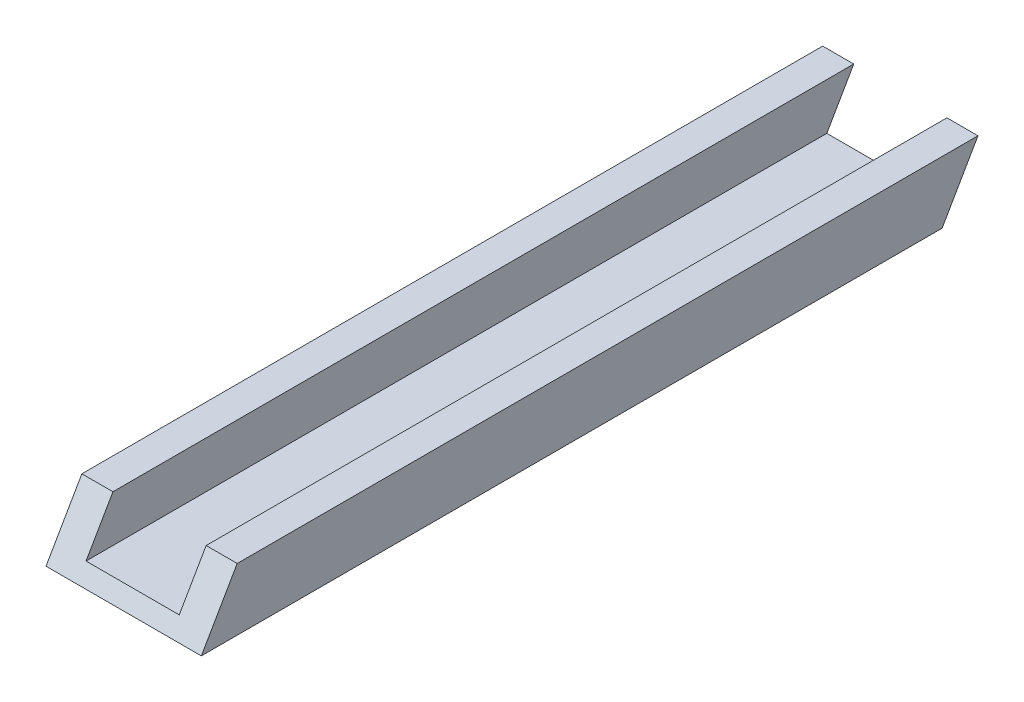
ISO-10303-21;
HEADER;
FILE_DESCRIPTION(('STEP AP214'),'2;1');
FILE_NAME('part.step','',(''),(''),'','','');
FILE_SCHEMA(('AUTOMOTIVE_DESIGN { 1 0 10303 214 1 1 1 1 }'));
ENDSEC;
DATA;
#1=APPLICATION_CONTEXT('core data for automotive mechanical design processes');
#2=APPLICATION_PROTOCOL_DEFINITION('international standard','automotive_design',2000,#1);
#3=PRODUCT_CONTEXT('',#1,'mechanical');
#4=PRODUCT('Part','Part','',(#3));
#5=PRODUCT_RELATED_PRODUCT_CATEGORY('part','',(#4));
#6=PRODUCT_DEFINITION_FORMATION('','',#4);
#7=PRODUCT_DEFINITION_CONTEXT('part definition',#1,'design');
#8=PRODUCT_DEFINITION('design','',#6,#7);
#9=PRODUCT_DEFINITION_SHAPE('','',#8);
#10=(LENGTH_UNIT() NAMED_UNIT(*) SI_UNIT(.MILLI.,.METRE.));
#11=(NAMED_UNIT(*) PLANE_ANGLE_UNIT() SI_UNIT($,.RADIAN.));
#12=(NAMED_UNIT(*) SI_UNIT($,.STERADIAN.) SOLID_ANGLE_UNIT());
#13=UNCERTAINTY_MEASURE_WITH_UNIT(LENGTH_MEASURE(1.E-05),#10,'distance_accuracy_value','');
#14=(GEOMETRIC_REPRESENTATION_CONTEXT(3) GLOBAL_UNCERTAINTY_ASSIGNED_CONTEXT((#13)) GLOBAL_UNIT_ASSIGNED_CONTEXT((#10,
#11,#12)) REPRESENTATION_CONTEXT('',''));
#15=CARTESIAN_POINT('',(0.,0.,0.));
#16=DIRECTION('',(0.,0.,1.));
#17=DIRECTION('',(1.,0.,0.));
#18=AXIS2_PLACEMENT_3D('',#15,#16,#17);
#19=CARTESIAN_POINT('',(0.,20.,0.));
#20=DIRECTION('',(0.,-1.,0.));
#21=DIRECTION('',(0.,0.,-1.));
#22=AXIS2_PLACEMENT_3D('',#19,#20,#21);
#23=PLANE('',#22);
#24=DIRECTION('',(0.,0.,1.));
#25=VECTOR('',#24,1.);
#26=CARTESIAN_POINT('',(40.,20.,-11.5470053837926));
#27=LINE('',#26,#25);
#28=CARTESIAN_POINT('',(40.,20.,-250.));
#29=VERTEX_POINT('',#28);
#30=CARTESIAN_POINT('',(40.,20.,-11.5470053837926));
#31=VERTEX_POINT('',#30);
#32=EDGE_CURVE('E134',#29,#31,#27,.T.);
#33=ORIENTED_EDGE('',*,*,#32,.T.);
#34=DIRECTION('',(1.,0.,0.));
#35=VECTOR('',#34,1.);
#36=CARTESIAN_POINT('',(0.,20.,-11.5470053837926));
#37=LINE('',#36,#35);
#38=CARTESIAN_POINT('',(50.,20.,-11.5470053837926));
#39=VERTEX_POINT('',#38);
#40=EDGE_CURVE('E158',#31,#39,#37,.T.);
#41=ORIENTED_EDGE('',*,*,#40,.T.);
#42=DIRECTION('',(0.,0.,-1.));
#43=VECTOR('',#42,1.);
#44=CARTESIAN_POINT('',(50.,20.,0.));
#45=LINE('',#44,#43);
#46=CARTESIAN_POINT('',(50.,20.,-250.));
#47=VERTEX_POINT('',#46);
#48=EDGE_CURVE('E172',#39,#47,#45,.T.);
#49=ORIENTED_EDGE('',*,*,#48,.T.);
#50=DIRECTION('',(-1.,0.,0.));
#51=VECTOR('',#50,1.);
#52=CARTESIAN_POINT('',(0.,20.,-250.));
#53=LINE('',#52,#51);
#54=EDGE_CURVE('E12',#47,#29,#53,.T.);
#55=ORIENTED_EDGE('',*,*,#54,.T.);
#56=EDGE_LOOP('',(#33,#41,#49,#55));
#57=FACE_BOUND('',#56,.T.);
#58=ADVANCED_FACE('F46',(#57),#23,.F.);
#59=CARTESIAN_POINT('',(0.,20.,0.));
#60=DIRECTION('',(1.,0.,0.));
#61=DIRECTION('',(0.,0.,-1.));
#62=AXIS2_PLACEMENT_3D('',#59,#60,#61);
#63=PLANE('',#62);
#64=DIRECTION('',(0.,-0.866025403784436,0.500000000000004));
#65=VECTOR('',#64,1.);
#66=CARTESIAN_POINT('',(0.,0.,0.));
#67=LINE('',#66,#65);
#68=CARTESIAN_POINT('',(0.,20.,-11.5470053837926));
#69=VERTEX_POINT('',#68);
#70=CARTESIAN_POINT('',(0.,0.,0.));
#71=VERTEX_POINT('',#70);
#72=EDGE_CURVE('E151',#69,#71,#67,.T.);
#73=ORIENTED_EDGE('',*,*,#72,.F.);
#74=DIRECTION('',(0.,0.,1.));
#75=VECTOR('',#74,1.);
#76=CARTESIAN_POINT('',(0.,20.,0.));
#77=LINE('',#76,#75);
#78=CARTESIAN_POINT('',(0.,20.,-250.));
#79=VERTEX_POINT('',#78);
#80=EDGE_CURVE('E168',#79,#69,#77,.T.);
#81=ORIENTED_EDGE('',*,*,#80,.F.);
#82=DIRECTION('',(0.,0.866025403784436,-0.500000000000005));
#83=VECTOR('',#82,1.);
#84=CARTESIAN_POINT('',(0.,20.,-250.));
#85=LINE('',#84,#83);
#86=CARTESIAN_POINT('',(0.,0.,-238.452994616207));
#87=VERTEX_POINT('',#86);
#88=EDGE_CURVE('E143',#87,#79,#85,.T.);
#89=ORIENTED_EDGE('',*,*,#88,.F.);
#90=DIRECTION('',(0.,0.,1.));
#91=VECTOR('',#90,1.);
#92=CARTESIAN_POINT('',(0.,0.,0.));
#93=LINE('',#92,#91);
#94=EDGE_CURVE('E167',#87,#71,#93,.T.);
#95=ORIENTED_EDGE('',*,*,#94,.T.);
#96=EDGE_LOOP('',(#73,#81,#89,#95));
#97=FACE_BOUND('',#96,.T.);
#98=ADVANCED_FACE('F48',(#97),#63,.F.);
#99=CARTESIAN_POINT('',(50.,20.,0.));
#100=DIRECTION('',(-1.,0.,0.));
#101=DIRECTION('',(0.,0.,1.));
#102=AXIS2_PLACEMENT_3D('',#99,#100,#101);
#103=PLANE('',#102);
#104=DIRECTION('',(0.,0.866025403784436,-0.500000000000004));
#105=VECTOR('',#104,1.);
#106=CARTESIAN_POINT('',(50.,14.9999999999999,-8.66025403784443));
#107=LINE('',#106,#105);
#108=CARTESIAN_POINT('',(50.,0.,0.));
#109=VERTEX_POINT('',#108);
#110=EDGE_CURVE('E163',#109,#39,#107,.T.);
#111=ORIENTED_EDGE('',*,*,#110,.F.);
#112=DIRECTION('',(0.,0.,-1.));
#113=VECTOR('',#112,1.);
#114=CARTESIAN_POINT('',(50.,0.,0.));
#115=LINE('',#114,#113);
#116=CARTESIAN_POINT('',(50.,0.,-238.452994616207));
#117=VERTEX_POINT('',#116);
#118=EDGE_CURVE('E50',#109,#117,#115,.T.);
#119=ORIENTED_EDGE('',*,*,#118,.T.);
#120=DIRECTION('',(0.,-0.866025403784436,0.500000000000005));
#121=VECTOR('',#120,1.);
#122=CARTESIAN_POINT('',(50.,-88.2531754730555,-187.499999999999));
#123=LINE('',#122,#121);
#124=EDGE_CURVE('E72',#47,#117,#123,.T.);
#125=ORIENTED_EDGE('',*,*,#124,.F.);
#126=ORIENTED_EDGE('',*,*,#48,.F.);
#127=EDGE_LOOP('',(#111,#119,#125,#126));
#128=FACE_BOUND('',#127,.T.);
#129=ADVANCED_FACE('F186',(#128),#103,.F.);
#130=CARTESIAN_POINT('',(10.,20.,-11.5470053837926));
#131=VERTEX_POINT('',#130);
#132=EDGE_CURVE('E155',#69,#131,#37,.T.);
#133=ORIENTED_EDGE('',*,*,#132,.T.);
#134=DIRECTION('',(0.,0.,1.));
#135=VECTOR('',#134,1.);
#136=CARTESIAN_POINT('',(10.,20.,-11.5470053837926));
#137=LINE('',#136,#135);
#138=CARTESIAN_POINT('',(10.,20.,-250.));
#139=VERTEX_POINT('',#138);
#140=EDGE_CURVE('E130',#139,#131,#137,.T.);
#141=ORIENTED_EDGE('',*,*,#140,.F.);
#142=EDGE_CURVE('E56',#139,#79,#53,.T.);
#143=ORIENTED_EDGE('',*,*,#142,.T.);
#144=ORIENTED_EDGE('',*,*,#80,.T.);
#145=EDGE_LOOP('',(#133,#141,#143,#144));
#146=FACE_BOUND('',#145,.T.);
#147=ADVANCED_FACE('F198',(#146),#23,.F.);
#148=CARTESIAN_POINT('',(0.,0.,0.));
#149=DIRECTION('',(0.,-1.,0.));
#150=DIRECTION('',(0.,0.,-1.));
#151=AXIS2_PLACEMENT_3D('',#148,#149,#150);
#152=PLANE('',#151);
#153=ORIENTED_EDGE('',*,*,#94,.F.);
#154=DIRECTION('',(1.,0.,0.));
#155=VECTOR('',#154,1.);
#156=CARTESIAN_POINT('',(0.,0.,-238.452994616207));
#157=LINE('',#156,#155);
#158=EDGE_CURVE('E154',#87,#117,#157,.T.);
#159=ORIENTED_EDGE('',*,*,#158,.T.);
#160=ORIENTED_EDGE('',*,*,#118,.F.);
#161=DIRECTION('',(1.,0.,0.));
#162=VECTOR('',#161,1.);
#163=CARTESIAN_POINT('',(0.,0.,0.));
#164=LINE('',#163,#162);
#165=EDGE_CURVE('E178',#71,#109,#164,.T.);
#166=ORIENTED_EDGE('',*,*,#165,.F.);
#167=EDGE_LOOP('',(#153,#159,#160,#166));
#168=FACE_BOUND('',#167,.T.);
#169=ADVANCED_FACE('F190',(#168),#152,.T.);
#170=CARTESIAN_POINT('',(0.,20.,-250.));
#171=DIRECTION('',(0.,-0.500000000000005,-0.866025403784436));
#172=DIRECTION('',(0.,0.866025403784436,-0.500000000000005));
#173=AXIS2_PLACEMENT_3D('',#170,#171,#172);
#174=PLANE('',#173);
#175=DIRECTION('',(0.,0.866025403784439,-0.5));
#176=VECTOR('',#175,1.);
#177=CARTESIAN_POINT('',(10.,20.,-250.));
#178=LINE('',#177,#176);
#179=CARTESIAN_POINT('',(10.,5.,-241.339745962156));
#180=VERTEX_POINT('',#179);
#181=EDGE_CURVE('E124',#180,#139,#178,.T.);
#182=ORIENTED_EDGE('',*,*,#181,.F.);
#183=DIRECTION('',(1.,0.,0.));
#184=VECTOR('',#183,1.);
#185=CARTESIAN_POINT('',(10.,5.,-241.339745962156));
#186=LINE('',#185,#184);
#187=CARTESIAN_POINT('',(40.,5.,-241.339745962156));
#188=VERTEX_POINT('',#187);
#189=EDGE_CURVE('E120',#180,#188,#186,.T.);
#190=ORIENTED_EDGE('',*,*,#189,.T.);
#191=DIRECTION('',(0.,0.866025403784439,-0.5));
#192=VECTOR('',#191,1.);
#193=CARTESIAN_POINT('',(40.,20.,-250.));
#194=LINE('',#193,#192);
#195=EDGE_CURVE('E208',#188,#29,#194,.T.);
#196=ORIENTED_EDGE('',*,*,#195,.T.);
#197=ORIENTED_EDGE('',*,*,#54,.F.);
#198=ORIENTED_EDGE('',*,*,#124,.T.);
#199=ORIENTED_EDGE('',*,*,#158,.F.);
#200=ORIENTED_EDGE('',*,*,#88,.T.);
#201=ORIENTED_EDGE('',*,*,#142,.F.);
#202=EDGE_LOOP('',(#182,#190,#196,#197,#198,#199,#200,#201));
#203=FACE_BOUND('',#202,.T.);
#204=ADVANCED_FACE('F192',(#203),#174,.T.);
#205=CARTESIAN_POINT('',(0.,0.,0.));
#206=DIRECTION('',(0.,0.500000000000004,0.866025403784436));
#207=DIRECTION('',(0.,-0.866025403784436,0.500000000000004));
#208=AXIS2_PLACEMENT_3D('',#205,#206,#207);
#209=PLANE('',#208);
#210=DIRECTION('',(0.,-0.866025403784436,0.500000000000005));
#211=VECTOR('',#210,1.);
#212=CARTESIAN_POINT('',(10.,4.99999999999997,-2.88675134594811));
#213=LINE('',#212,#211);
#214=CARTESIAN_POINT('',(10.,4.99999999999997,-2.88675134594811));
#215=VERTEX_POINT('',#214);
#216=EDGE_CURVE('E125',#131,#215,#213,.T.);
#217=ORIENTED_EDGE('',*,*,#216,.F.);
#218=ORIENTED_EDGE('',*,*,#132,.F.);
#219=ORIENTED_EDGE('',*,*,#72,.T.);
#220=ORIENTED_EDGE('',*,*,#165,.T.);
#221=ORIENTED_EDGE('',*,*,#110,.T.);
#222=ORIENTED_EDGE('',*,*,#40,.F.);
#223=DIRECTION('',(0.,-0.866025403784436,0.500000000000005));
#224=VECTOR('',#223,1.);
#225=CARTESIAN_POINT('',(40.,4.99999999999997,-2.88675134594811));
#226=LINE('',#225,#224);
#227=CARTESIAN_POINT('',(40.,4.99999999999997,-2.88675134594814));
#228=VERTEX_POINT('',#227);
#229=EDGE_CURVE('E138',#31,#228,#226,.T.);
#230=ORIENTED_EDGE('',*,*,#229,.T.);
#231=DIRECTION('',(1.,0.,0.));
#232=VECTOR('',#231,1.);
#233=CARTESIAN_POINT('',(10.,4.99999999999997,-2.88675134594811));
#234=LINE('',#233,#232);
#235=EDGE_CURVE('E117',#215,#228,#234,.T.);
#236=ORIENTED_EDGE('',*,*,#235,.F.);
#237=EDGE_LOOP('',(#217,#218,#219,#220,#221,#222,#230,#236));
#238=FACE_BOUND('',#237,.T.);
#239=ADVANCED_FACE('F136',(#238),#209,.T.);
#240=CARTESIAN_POINT('',(10.,5.,-241.339745962156));
#241=DIRECTION('',(0.,-1.,0.));
#242=DIRECTION('',(0.,0.,-1.));
#243=AXIS2_PLACEMENT_3D('',#240,#241,#242);
#244=PLANE('',#243);
#245=DIRECTION('',(0.,0.,-1.));
#246=VECTOR('',#245,1.);
#247=CARTESIAN_POINT('',(40.,5.,-241.339745962156));
#248=LINE('',#247,#246);
#249=EDGE_CURVE('E64',#228,#188,#248,.T.);
#250=ORIENTED_EDGE('',*,*,#249,.T.);
#251=ORIENTED_EDGE('',*,*,#189,.F.);
#252=DIRECTION('',(0.,0.,-1.));
#253=VECTOR('',#252,1.);
#254=CARTESIAN_POINT('',(10.,5.,-241.339745962156));
#255=LINE('',#254,#253);
#256=EDGE_CURVE('E113',#215,#180,#255,.T.);
#257=ORIENTED_EDGE('',*,*,#256,.F.);
#258=ORIENTED_EDGE('',*,*,#235,.T.);
#259=EDGE_LOOP('',(#250,#251,#257,#258));
#260=FACE_BOUND('',#259,.T.);
#261=ADVANCED_FACE('F115',(#260),#244,.F.);
#262=CARTESIAN_POINT('',(10.,0.,0.));
#263=DIRECTION('',(-1.,0.,0.));
#264=DIRECTION('',(0.,0.,1.));
#265=AXIS2_PLACEMENT_3D('',#262,#263,#264);
#266=PLANE('',#265);
#267=ORIENTED_EDGE('',*,*,#216,.T.);
#268=ORIENTED_EDGE('',*,*,#256,.T.);
#269=ORIENTED_EDGE('',*,*,#181,.T.);
#270=ORIENTED_EDGE('',*,*,#140,.T.);
#271=EDGE_LOOP('',(#267,#268,#269,#270));
#272=FACE_BOUND('',#271,.T.);
#273=ADVANCED_FACE('F128',(#272),#266,.F.);
#274=CARTESIAN_POINT('',(40.,0.,0.));
#275=DIRECTION('',(-1.,0.,0.));
#276=DIRECTION('',(0.,0.,1.));
#277=AXIS2_PLACEMENT_3D('',#274,#275,#276);
#278=PLANE('',#277);
#279=ORIENTED_EDGE('',*,*,#229,.F.);
#280=ORIENTED_EDGE('',*,*,#32,.F.);
#281=ORIENTED_EDGE('',*,*,#195,.F.);
#282=ORIENTED_EDGE('',*,*,#249,.F.);
#283=EDGE_LOOP('',(#279,#280,#281,#282));
#284=FACE_BOUND('',#283,.T.);
#285=ADVANCED_FACE('F214',(#284),#278,.T.);
#286=CLOSED_SHELL('',(#58,#98,#129,#147,#169,#204,#239,#261,#273,#285));
#287=MANIFOLD_SOLID_BREP('B2',#286);
#288=ADVANCED_BREP_SHAPE_REPRESENTATION('',(#18,#287),#14);
#289=SHAPE_DEFINITION_REPRESENTATION(#9,#288);
ENDSEC;
END-ISO-10303-21;
